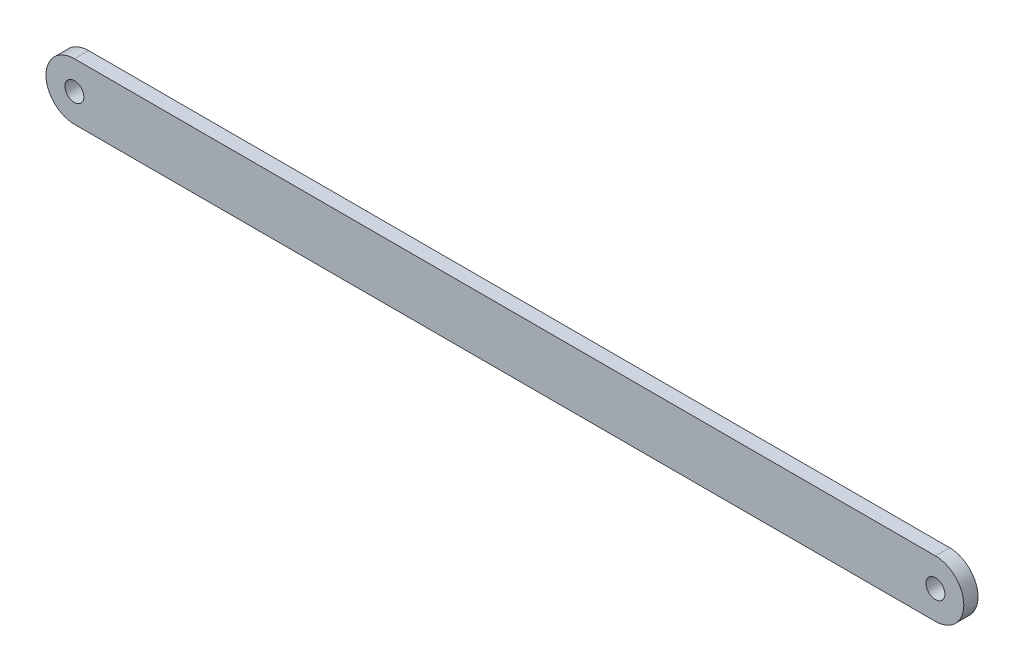
ISO-10303-21;
HEADER;
FILE_DESCRIPTION(('STEP AP214'),'2;1');
FILE_NAME('part.step','',(''),(''),'','','');
FILE_SCHEMA(('AUTOMOTIVE_DESIGN { 1 0 10303 214 1 1 1 1 }'));
ENDSEC;
DATA;
#1=APPLICATION_CONTEXT('core data for automotive mechanical design processes');
#2=APPLICATION_PROTOCOL_DEFINITION('international standard','automotive_design',2000,#1);
#3=PRODUCT_CONTEXT('',#1,'mechanical');
#4=PRODUCT('Part','Part','',(#3));
#5=PRODUCT_RELATED_PRODUCT_CATEGORY('part','',(#4));
#6=PRODUCT_DEFINITION_FORMATION('','',#4);
#7=PRODUCT_DEFINITION_CONTEXT('part definition',#1,'design');
#8=PRODUCT_DEFINITION('design','',#6,#7);
#9=PRODUCT_DEFINITION_SHAPE('','',#8);
#10=(LENGTH_UNIT() NAMED_UNIT(*) SI_UNIT(.MILLI.,.METRE.));
#11=(NAMED_UNIT(*) PLANE_ANGLE_UNIT() SI_UNIT($,.RADIAN.));
#12=(NAMED_UNIT(*) SI_UNIT($,.STERADIAN.) SOLID_ANGLE_UNIT());
#13=UNCERTAINTY_MEASURE_WITH_UNIT(LENGTH_MEASURE(1.E-05),#10,'distance_accuracy_value','');
#14=(GEOMETRIC_REPRESENTATION_CONTEXT(3) GLOBAL_UNCERTAINTY_ASSIGNED_CONTEXT((#13)) GLOBAL_UNIT_ASSIGNED_CONTEXT((#10,
#11,#12)) REPRESENTATION_CONTEXT('',''));
#15=CARTESIAN_POINT('',(0.,0.,0.));
#16=DIRECTION('',(0.,0.,1.));
#17=DIRECTION('',(1.,0.,0.));
#18=AXIS2_PLACEMENT_3D('',#15,#16,#17);
#19=CARTESIAN_POINT('',(-35.3127241673783,0.,3.));
#20=DIRECTION('',(0.,0.,1.));
#21=DIRECTION('',(1.,0.,0.));
#22=AXIS2_PLACEMENT_3D('',#19,#20,#21);
#23=PLANE('',#22);
#24=CARTESIAN_POINT('',(-35.3127241673783,0.,3.));
#25=DIRECTION('',(0.,0.,1.));
#26=DIRECTION('',(1.,0.,0.));
#27=AXIS2_PLACEMENT_3D('',#24,#25,#26);
#28=CIRCLE('',#27,2.);
#29=CARTESIAN_POINT('',(-33.3127241673783,0.,3.));
#30=VERTEX_POINT('',#29);
#31=EDGE_CURVE('E100',#30,#30,#28,.T.);
#32=ORIENTED_EDGE('',*,*,#31,.F.);
#33=EDGE_LOOP('',(#32));
#34=FACE_BOUND('',#33,.T.);
#35=CARTESIAN_POINT('',(-35.3127241673783,0.,3.));
#36=DIRECTION('',(0.,0.,1.));
#37=DIRECTION('',(1.,0.,0.));
#38=AXIS2_PLACEMENT_3D('',#35,#36,#37);
#39=CIRCLE('',#38,6.);
#40=CARTESIAN_POINT('',(-35.3127241673783,6.,3.));
#41=VERTEX_POINT('',#40);
#42=CARTESIAN_POINT('',(-35.3127241673783,-6.,3.));
#43=VERTEX_POINT('',#42);
#44=EDGE_CURVE('E85',#41,#43,#39,.T.);
#45=ORIENTED_EDGE('',*,*,#44,.T.);
#46=DIRECTION('',(1.,0.,0.));
#47=VECTOR('',#46,1.);
#48=CARTESIAN_POINT('',(-35.3127241673783,-6.,3.));
#49=LINE('',#48,#47);
#50=CARTESIAN_POINT('',(146.687275832622,-6.,3.));
#51=VERTEX_POINT('',#50);
#52=EDGE_CURVE('E80',#43,#51,#49,.T.);
#53=ORIENTED_EDGE('',*,*,#52,.T.);
#54=CARTESIAN_POINT('',(146.687275832622,0.,3.));
#55=DIRECTION('',(0.,0.,1.));
#56=DIRECTION('',(1.,0.,0.));
#57=AXIS2_PLACEMENT_3D('',#54,#55,#56);
#58=CIRCLE('',#57,6.);
#59=CARTESIAN_POINT('',(146.687275832622,6.,3.));
#60=VERTEX_POINT('',#59);
#61=EDGE_CURVE('E83',#51,#60,#58,.T.);
#62=ORIENTED_EDGE('',*,*,#61,.T.);
#63=DIRECTION('',(-1.,0.,0.));
#64=VECTOR('',#63,1.);
#65=CARTESIAN_POINT('',(-35.3127241673783,6.,3.));
#66=LINE('',#65,#64);
#67=EDGE_CURVE('E50',#60,#41,#66,.T.);
#68=ORIENTED_EDGE('',*,*,#67,.T.);
#69=EDGE_LOOP('',(#45,#53,#62,#68));
#70=FACE_BOUND('',#69,.T.);
#71=CARTESIAN_POINT('',(146.687275832622,0.,3.));
#72=DIRECTION('',(0.,0.,1.));
#73=DIRECTION('',(1.,0.,0.));
#74=AXIS2_PLACEMENT_3D('',#71,#72,#73);
#75=CIRCLE('',#74,2.);
#76=CARTESIAN_POINT('',(148.687275832622,0.,3.));
#77=VERTEX_POINT('',#76);
#78=EDGE_CURVE('E115',#77,#77,#75,.T.);
#79=ORIENTED_EDGE('',*,*,#78,.F.);
#80=EDGE_LOOP('',(#79));
#81=FACE_BOUND('',#80,.T.);
#82=ADVANCED_FACE('F33',(#34,#70,#81),#23,.T.);
#83=CARTESIAN_POINT('',(-35.3127241673783,0.,0.));
#84=DIRECTION('',(0.,0.,1.));
#85=DIRECTION('',(1.,0.,0.));
#86=AXIS2_PLACEMENT_3D('',#83,#84,#85);
#87=PLANE('',#86);
#88=CARTESIAN_POINT('',(-35.3127241673783,0.,0.));
#89=DIRECTION('',(0.,0.,1.));
#90=DIRECTION('',(1.,0.,0.));
#91=AXIS2_PLACEMENT_3D('',#88,#89,#90);
#92=CIRCLE('',#91,2.);
#93=CARTESIAN_POINT('',(-33.3127241673783,0.,0.));
#94=VERTEX_POINT('',#93);
#95=EDGE_CURVE('E112',#94,#94,#92,.T.);
#96=ORIENTED_EDGE('',*,*,#95,.T.);
#97=EDGE_LOOP('',(#96));
#98=FACE_BOUND('',#97,.T.);
#99=CARTESIAN_POINT('',(-35.3127241673783,0.,0.));
#100=DIRECTION('',(0.,0.,1.));
#101=DIRECTION('',(1.,0.,0.));
#102=AXIS2_PLACEMENT_3D('',#99,#100,#101);
#103=CIRCLE('',#102,6.);
#104=CARTESIAN_POINT('',(-35.3127241673783,6.,0.));
#105=VERTEX_POINT('',#104);
#106=CARTESIAN_POINT('',(-35.3127241673783,-6.,0.));
#107=VERTEX_POINT('',#106);
#108=EDGE_CURVE('E97',#105,#107,#103,.T.);
#109=ORIENTED_EDGE('',*,*,#108,.F.);
#110=DIRECTION('',(-1.,0.,0.));
#111=VECTOR('',#110,1.);
#112=CARTESIAN_POINT('',(-35.3127241673783,6.,0.));
#113=LINE('',#112,#111);
#114=CARTESIAN_POINT('',(146.687275832622,6.,0.));
#115=VERTEX_POINT('',#114);
#116=EDGE_CURVE('E73',#115,#105,#113,.T.);
#117=ORIENTED_EDGE('',*,*,#116,.F.);
#118=CARTESIAN_POINT('',(146.687275832622,0.,0.));
#119=DIRECTION('',(0.,0.,1.));
#120=DIRECTION('',(1.,0.,0.));
#121=AXIS2_PLACEMENT_3D('',#118,#119,#120);
#122=CIRCLE('',#121,6.);
#123=CARTESIAN_POINT('',(146.687275832622,-6.,0.));
#124=VERTEX_POINT('',#123);
#125=EDGE_CURVE('E67',#124,#115,#122,.T.);
#126=ORIENTED_EDGE('',*,*,#125,.F.);
#127=DIRECTION('',(1.,0.,0.));
#128=VECTOR('',#127,1.);
#129=CARTESIAN_POINT('',(-35.3127241673783,-6.,0.));
#130=LINE('',#129,#128);
#131=EDGE_CURVE('E89',#107,#124,#130,.T.);
#132=ORIENTED_EDGE('',*,*,#131,.F.);
#133=EDGE_LOOP('',(#109,#117,#126,#132));
#134=FACE_BOUND('',#133,.T.);
#135=CARTESIAN_POINT('',(146.687275832622,0.,0.));
#136=DIRECTION('',(0.,0.,1.));
#137=DIRECTION('',(1.,0.,0.));
#138=AXIS2_PLACEMENT_3D('',#135,#136,#137);
#139=CIRCLE('',#138,2.);
#140=CARTESIAN_POINT('',(148.687275832622,0.,0.));
#141=VERTEX_POINT('',#140);
#142=EDGE_CURVE('E118',#141,#141,#139,.T.);
#143=ORIENTED_EDGE('',*,*,#142,.T.);
#144=EDGE_LOOP('',(#143));
#145=FACE_BOUND('',#144,.T.);
#146=ADVANCED_FACE('F108',(#98,#134,#145),#87,.F.);
#147=CARTESIAN_POINT('',(-35.3127241673783,0.,3.));
#148=DIRECTION('',(0.,0.,-1.));
#149=DIRECTION('',(-1.,0.,0.));
#150=AXIS2_PLACEMENT_3D('',#147,#148,#149);
#151=CYLINDRICAL_SURFACE('',#150,6.);
#152=ORIENTED_EDGE('',*,*,#108,.T.);
#153=DIRECTION('',(0.,0.,-1.));
#154=VECTOR('',#153,1.);
#155=CARTESIAN_POINT('',(-35.3127241673783,-6.,3.));
#156=LINE('',#155,#154);
#157=EDGE_CURVE('E11',#43,#107,#156,.T.);
#158=ORIENTED_EDGE('',*,*,#157,.F.);
#159=ORIENTED_EDGE('',*,*,#44,.F.);
#160=DIRECTION('',(0.,0.,-1.));
#161=VECTOR('',#160,1.);
#162=CARTESIAN_POINT('',(-35.3127241673783,6.,3.));
#163=LINE('',#162,#161);
#164=EDGE_CURVE('E93',#41,#105,#163,.T.);
#165=ORIENTED_EDGE('',*,*,#164,.T.);
#166=EDGE_LOOP('',(#152,#158,#159,#165));
#167=FACE_BOUND('',#166,.T.);
#168=ADVANCED_FACE('F35',(#167),#151,.T.);
#169=CARTESIAN_POINT('',(-35.3127241673783,-6.,3.));
#170=DIRECTION('',(0.,1.,0.));
#171=DIRECTION('',(0.,0.,1.));
#172=AXIS2_PLACEMENT_3D('',#169,#170,#171);
#173=PLANE('',#172);
#174=ORIENTED_EDGE('',*,*,#131,.T.);
#175=DIRECTION('',(0.,0.,-1.));
#176=VECTOR('',#175,1.);
#177=CARTESIAN_POINT('',(146.687275832622,-6.,3.));
#178=LINE('',#177,#176);
#179=EDGE_CURVE('E42',#51,#124,#178,.T.);
#180=ORIENTED_EDGE('',*,*,#179,.F.);
#181=ORIENTED_EDGE('',*,*,#52,.F.);
#182=ORIENTED_EDGE('',*,*,#157,.T.);
#183=EDGE_LOOP('',(#174,#180,#181,#182));
#184=FACE_BOUND('',#183,.T.);
#185=ADVANCED_FACE('F88',(#184),#173,.F.);
#186=CARTESIAN_POINT('',(146.687275832622,0.,3.));
#187=DIRECTION('',(0.,0.,-1.));
#188=DIRECTION('',(-1.,0.,0.));
#189=AXIS2_PLACEMENT_3D('',#186,#187,#188);
#190=CYLINDRICAL_SURFACE('',#189,6.);
#191=ORIENTED_EDGE('',*,*,#125,.T.);
#192=DIRECTION('',(0.,0.,-1.));
#193=VECTOR('',#192,1.);
#194=CARTESIAN_POINT('',(146.687275832622,6.,3.));
#195=LINE('',#194,#193);
#196=EDGE_CURVE('E90',#60,#115,#195,.T.);
#197=ORIENTED_EDGE('',*,*,#196,.F.);
#198=ORIENTED_EDGE('',*,*,#61,.F.);
#199=ORIENTED_EDGE('',*,*,#179,.T.);
#200=EDGE_LOOP('',(#191,#197,#198,#199));
#201=FACE_BOUND('',#200,.T.);
#202=ADVANCED_FACE('F91',(#201),#190,.T.);
#203=CARTESIAN_POINT('',(-35.3127241673783,6.,3.));
#204=DIRECTION('',(0.,-1.,0.));
#205=DIRECTION('',(0.,0.,-1.));
#206=AXIS2_PLACEMENT_3D('',#203,#204,#205);
#207=PLANE('',#206);
#208=ORIENTED_EDGE('',*,*,#116,.T.);
#209=ORIENTED_EDGE('',*,*,#164,.F.);
#210=ORIENTED_EDGE('',*,*,#67,.F.);
#211=ORIENTED_EDGE('',*,*,#196,.T.);
#212=EDGE_LOOP('',(#208,#209,#210,#211));
#213=FACE_BOUND('',#212,.T.);
#214=ADVANCED_FACE('F105',(#213),#207,.F.);
#215=CARTESIAN_POINT('',(-35.3127241673783,0.,3.));
#216=DIRECTION('',(0.,0.,-1.));
#217=DIRECTION('',(-1.,0.,0.));
#218=AXIS2_PLACEMENT_3D('',#215,#216,#217);
#219=CYLINDRICAL_SURFACE('',#218,2.);
#220=ORIENTED_EDGE('',*,*,#31,.T.);
#221=EDGE_LOOP('',(#220));
#222=FACE_BOUND('',#221,.T.);
#223=ORIENTED_EDGE('',*,*,#95,.F.);
#224=EDGE_LOOP('',(#223));
#225=FACE_BOUND('',#224,.T.);
#226=ADVANCED_FACE('F136',(#222,#225),#219,.F.);
#227=CARTESIAN_POINT('',(146.687275832622,0.,3.));
#228=DIRECTION('',(0.,0.,-1.));
#229=DIRECTION('',(-1.,0.,0.));
#230=AXIS2_PLACEMENT_3D('',#227,#228,#229);
#231=CYLINDRICAL_SURFACE('',#230,2.);
#232=ORIENTED_EDGE('',*,*,#78,.T.);
#233=EDGE_LOOP('',(#232));
#234=FACE_BOUND('',#233,.T.);
#235=ORIENTED_EDGE('',*,*,#142,.F.);
#236=EDGE_LOOP('',(#235));
#237=FACE_BOUND('',#236,.T.);
#238=ADVANCED_FACE('F124',(#234,#237),#231,.F.);
#239=CLOSED_SHELL('',(#82,#146,#168,#185,#202,#214,#226,#238));
#240=MANIFOLD_SOLID_BREP('B2',#239);
#241=ADVANCED_BREP_SHAPE_REPRESENTATION('',(#18,#240),#14);
#242=SHAPE_DEFINITION_REPRESENTATION(#9,#241);
ENDSEC;
END-ISO-10303-21;
